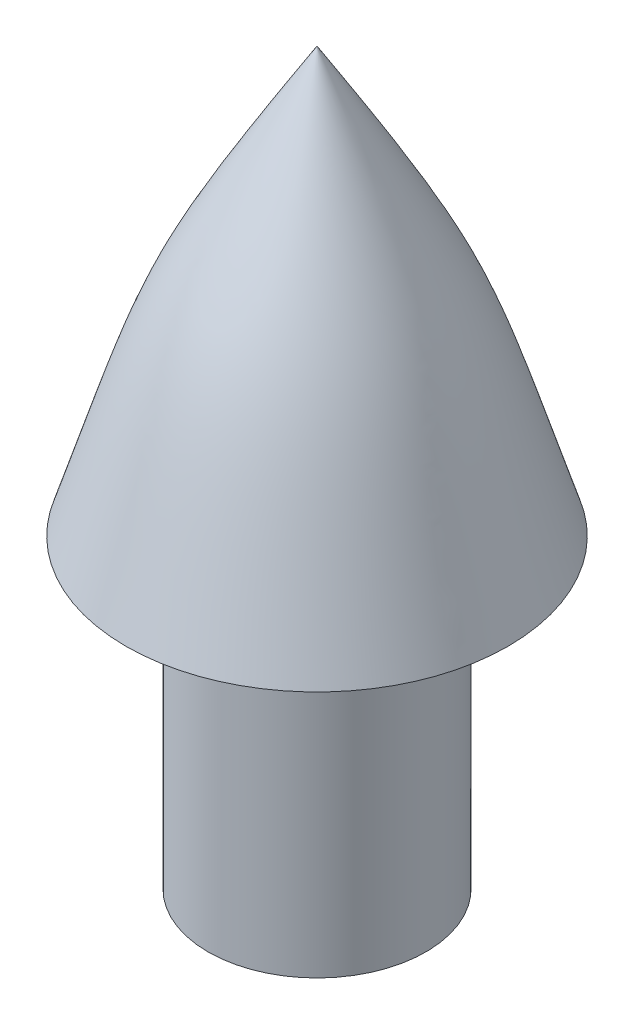
ISO-10303-21;
HEADER;
FILE_DESCRIPTION(('STEP AP214'),'2;1');
FILE_NAME('part.step','',(''),(''),'','','');
FILE_SCHEMA(('AUTOMOTIVE_DESIGN { 1 0 10303 214 1 1 1 1 }'));
ENDSEC;
DATA;
#1=APPLICATION_CONTEXT('core data for automotive mechanical design processes');
#2=APPLICATION_PROTOCOL_DEFINITION('international standard','automotive_design',2000,#1);
#3=PRODUCT_CONTEXT('',#1,'mechanical');
#4=PRODUCT('Part','Part','',(#3));
#5=PRODUCT_RELATED_PRODUCT_CATEGORY('part','',(#4));
#6=PRODUCT_DEFINITION_FORMATION('','',#4);
#7=PRODUCT_DEFINITION_CONTEXT('part definition',#1,'design');
#8=PRODUCT_DEFINITION('design','',#6,#7);
#9=PRODUCT_DEFINITION_SHAPE('','',#8);
#10=(LENGTH_UNIT() NAMED_UNIT(*) SI_UNIT(.MILLI.,.METRE.));
#11=(NAMED_UNIT(*) PLANE_ANGLE_UNIT() SI_UNIT($,.RADIAN.));
#12=(NAMED_UNIT(*) SI_UNIT($,.STERADIAN.) SOLID_ANGLE_UNIT());
#13=UNCERTAINTY_MEASURE_WITH_UNIT(LENGTH_MEASURE(1.E-05),#10,'distance_accuracy_value','');
#14=(GEOMETRIC_REPRESENTATION_CONTEXT(3) GLOBAL_UNCERTAINTY_ASSIGNED_CONTEXT((#13)) GLOBAL_UNIT_ASSIGNED_CONTEXT((#10,
#11,#12)) REPRESENTATION_CONTEXT('',''));
#15=CARTESIAN_POINT('',(0.,0.,0.));
#16=DIRECTION('',(0.,0.,1.));
#17=DIRECTION('',(1.,0.,0.));
#18=AXIS2_PLACEMENT_3D('',#15,#16,#17);
#19=CARTESIAN_POINT('',(2.5,0.,0.));
#20=CARTESIAN_POINT('',(1.63749463418985,2.74073643222087,0.));
#21=CARTESIAN_POINT('',(1.74478297075866,2.7146063658401,0.));
#22=CARTESIAN_POINT('',(0.,5.55,0.));
#23=B_SPLINE_CURVE_WITH_KNOTS('',3,(#19,#20,#21,#22),.UNSPECIFIED.,.F.,.F.,(4,4),(0.,1.),.UNSPECIFIED.);
#24=CARTESIAN_POINT('',(0.,5.85868170258157,0.));
#25=DIRECTION('',(0.,1.,0.));
#26=AXIS1_PLACEMENT('',#24,#25);
#27=SURFACE_OF_REVOLUTION('',#23,#26);
#28=CARTESIAN_POINT('',(0.,5.55,0.));
#29=VERTEX_POINT('',#28);
#30=VERTEX_LOOP('',#29);
#31=FACE_BOUND('',#30,.T.);
#32=CARTESIAN_POINT('',(0.,0.,0.));
#33=DIRECTION('',(0.,1.,0.));
#34=DIRECTION('',(0.,0.,1.));
#35=AXIS2_PLACEMENT_3D('',#32,#33,#34);
#36=CIRCLE('',#35,2.5);
#37=CARTESIAN_POINT('',(0.,0.,2.5));
#38=VERTEX_POINT('',#37);
#39=EDGE_CURVE('E55',#38,#38,#36,.T.);
#40=ORIENTED_EDGE('',*,*,#39,.T.);
#41=EDGE_LOOP('',(#40));
#42=FACE_BOUND('',#41,.T.);
#43=ADVANCED_FACE('F39',(#31,#42),#27,.T.);
#44=CARTESIAN_POINT('',(1.425,-4.,0.));
#45=DIRECTION('',(0.,1.,0.));
#46=DIRECTION('',(0.,0.,1.));
#47=AXIS2_PLACEMENT_3D('',#44,#45,#46);
#48=PLANE('',#47);
#49=CARTESIAN_POINT('',(0.,-4.,0.));
#50=DIRECTION('',(0.,1.,0.));
#51=DIRECTION('',(0.,0.,1.));
#52=AXIS2_PLACEMENT_3D('',#49,#50,#51);
#53=CIRCLE('',#52,1.425);
#54=CARTESIAN_POINT('',(0.,-4.,1.425));
#55=VERTEX_POINT('',#54);
#56=EDGE_CURVE('E11',#55,#55,#53,.T.);
#57=ORIENTED_EDGE('',*,*,#56,.F.);
#58=EDGE_LOOP('',(#57));
#59=FACE_BOUND('',#58,.T.);
#60=ADVANCED_FACE('F52',(#59),#48,.F.);
#61=CARTESIAN_POINT('',(0.,5.85868170258157,0.));
#62=DIRECTION('',(0.,1.,0.));
#63=DIRECTION('',(0.,0.,1.));
#64=AXIS2_PLACEMENT_3D('',#61,#62,#63);
#65=CYLINDRICAL_SURFACE('',#64,1.425);
#66=CARTESIAN_POINT('',(0.,0.,0.));
#67=DIRECTION('',(0.,1.,0.));
#68=DIRECTION('',(0.,0.,1.));
#69=AXIS2_PLACEMENT_3D('',#66,#67,#68);
#70=CIRCLE('',#69,1.425);
#71=CARTESIAN_POINT('',(0.,0.,1.425));
#72=VERTEX_POINT('',#71);
#73=EDGE_CURVE('E47',#72,#72,#70,.T.);
#74=ORIENTED_EDGE('',*,*,#73,.F.);
#75=EDGE_LOOP('',(#74));
#76=FACE_BOUND('',#75,.T.);
#77=ORIENTED_EDGE('',*,*,#56,.T.);
#78=EDGE_LOOP('',(#77));
#79=FACE_BOUND('',#78,.T.);
#80=ADVANCED_FACE('F71',(#76,#79),#65,.T.);
#81=CARTESIAN_POINT('',(2.5,0.,0.));
#82=DIRECTION('',(0.,1.,0.));
#83=DIRECTION('',(0.,0.,1.));
#84=AXIS2_PLACEMENT_3D('',#81,#82,#83);
#85=PLANE('',#84);
#86=ORIENTED_EDGE('',*,*,#39,.F.);
#87=EDGE_LOOP('',(#86));
#88=FACE_BOUND('',#87,.T.);
#89=ORIENTED_EDGE('',*,*,#73,.T.);
#90=EDGE_LOOP('',(#89));
#91=FACE_BOUND('',#90,.T.);
#92=ADVANCED_FACE('F69',(#88,#91),#85,.F.);
#93=CLOSED_SHELL('',(#43,#60,#80,#92));
#94=MANIFOLD_SOLID_BREP('B2',#93);
#95=ADVANCED_BREP_SHAPE_REPRESENTATION('',(#18,#94),#14);
#96=SHAPE_DEFINITION_REPRESENTATION(#9,#95);
ENDSEC;
END-ISO-10303-21;
